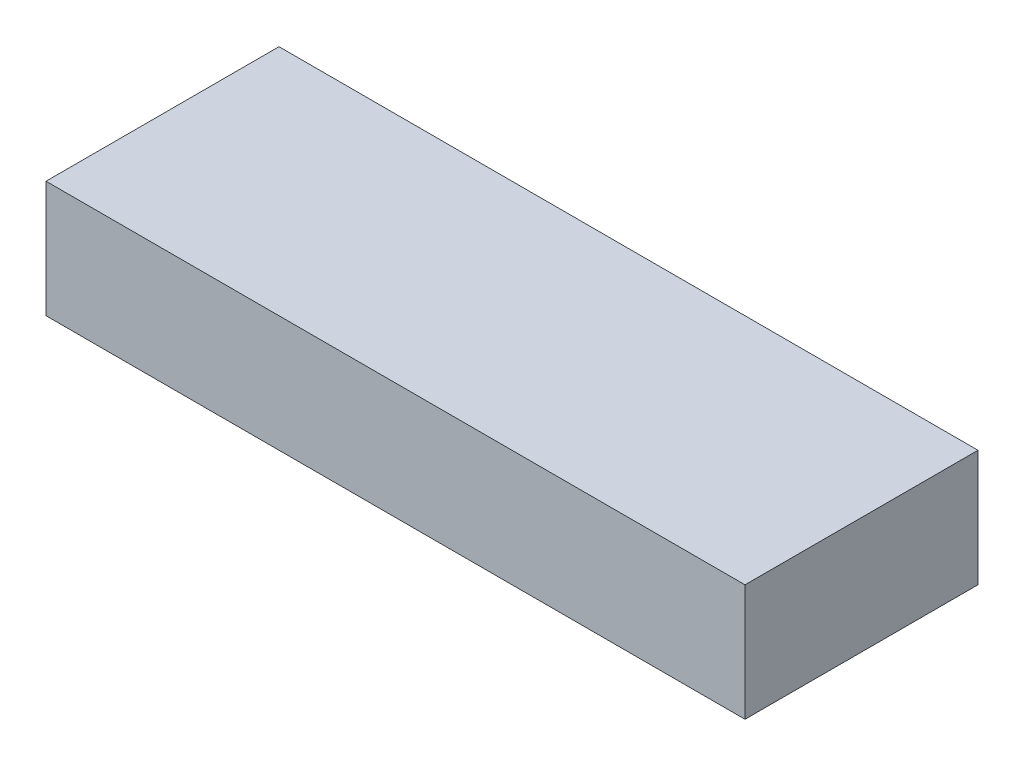
ISO-10303-21;
HEADER;
FILE_DESCRIPTION(('STEP AP214'),'2;1');
FILE_NAME('part.step','',(''),(''),'','','');
FILE_SCHEMA(('AUTOMOTIVE_DESIGN { 1 0 10303 214 1 1 1 1 }'));
ENDSEC;
DATA;
#1=APPLICATION_CONTEXT('core data for automotive mechanical design processes');
#2=APPLICATION_PROTOCOL_DEFINITION('international standard','automotive_design',2000,#1);
#3=PRODUCT_CONTEXT('',#1,'mechanical');
#4=PRODUCT('Part','Part','',(#3));
#5=PRODUCT_RELATED_PRODUCT_CATEGORY('part','',(#4));
#6=PRODUCT_DEFINITION_FORMATION('','',#4);
#7=PRODUCT_DEFINITION_CONTEXT('part definition',#1,'design');
#8=PRODUCT_DEFINITION('design','',#6,#7);
#9=PRODUCT_DEFINITION_SHAPE('','',#8);
#10=(LENGTH_UNIT() NAMED_UNIT(*) SI_UNIT(.MILLI.,.METRE.));
#11=(NAMED_UNIT(*) PLANE_ANGLE_UNIT() SI_UNIT($,.RADIAN.));
#12=(NAMED_UNIT(*) SI_UNIT($,.STERADIAN.) SOLID_ANGLE_UNIT());
#13=UNCERTAINTY_MEASURE_WITH_UNIT(LENGTH_MEASURE(1.E-05),#10,'distance_accuracy_value','');
#14=(GEOMETRIC_REPRESENTATION_CONTEXT(3) GLOBAL_UNCERTAINTY_ASSIGNED_CONTEXT((#13)) GLOBAL_UNIT_ASSIGNED_CONTEXT((#10,
#11,#12)) REPRESENTATION_CONTEXT('',''));
#15=CARTESIAN_POINT('',(0.,0.,0.));
#16=DIRECTION('',(0.,0.,1.));
#17=DIRECTION('',(1.,0.,0.));
#18=AXIS2_PLACEMENT_3D('',#15,#16,#17);
#19=CARTESIAN_POINT('',(38.1,6.35,12.7));
#20=DIRECTION('',(-1.,0.,0.));
#21=DIRECTION('',(0.,0.,1.));
#22=AXIS2_PLACEMENT_3D('',#19,#20,#21);
#23=PLANE('',#22);
#24=DIRECTION('',(0.,0.,-1.));
#25=VECTOR('',#24,1.);
#26=CARTESIAN_POINT('',(38.1,-6.35,12.7));
#27=LINE('',#26,#25);
#28=CARTESIAN_POINT('',(38.1,-6.35,12.7));
#29=VERTEX_POINT('',#28);
#30=CARTESIAN_POINT('',(38.1,-6.35,-12.7));
#31=VERTEX_POINT('',#30);
#32=EDGE_CURVE('E98',#29,#31,#27,.T.);
#33=ORIENTED_EDGE('',*,*,#32,.T.);
#34=DIRECTION('',(0.,-1.,0.));
#35=VECTOR('',#34,1.);
#36=CARTESIAN_POINT('',(38.1,6.35,-12.7));
#37=LINE('',#36,#35);
#38=CARTESIAN_POINT('',(38.1,6.35,-12.7));
#39=VERTEX_POINT('',#38);
#40=EDGE_CURVE('E11',#39,#31,#37,.T.);
#41=ORIENTED_EDGE('',*,*,#40,.F.);
#42=DIRECTION('',(0.,0.,-1.));
#43=VECTOR('',#42,1.);
#44=CARTESIAN_POINT('',(38.1,6.35,12.7));
#45=LINE('',#44,#43);
#46=CARTESIAN_POINT('',(38.1,6.35,12.7));
#47=VERTEX_POINT('',#46);
#48=EDGE_CURVE('E86',#47,#39,#45,.T.);
#49=ORIENTED_EDGE('',*,*,#48,.F.);
#50=DIRECTION('',(0.,-1.,0.));
#51=VECTOR('',#50,1.);
#52=CARTESIAN_POINT('',(38.1,6.35,12.7));
#53=LINE('',#52,#51);
#54=EDGE_CURVE('E94',#47,#29,#53,.T.);
#55=ORIENTED_EDGE('',*,*,#54,.T.);
#56=EDGE_LOOP('',(#33,#41,#49,#55));
#57=FACE_BOUND('',#56,.T.);
#58=ADVANCED_FACE('F35',(#57),#23,.F.);
#59=CARTESIAN_POINT('',(-38.1,6.35,-12.7));
#60=DIRECTION('',(0.,0.,1.));
#61=DIRECTION('',(1.,0.,0.));
#62=AXIS2_PLACEMENT_3D('',#59,#60,#61);
#63=PLANE('',#62);
#64=DIRECTION('',(-1.,0.,0.));
#65=VECTOR('',#64,1.);
#66=CARTESIAN_POINT('',(-38.1,-6.35,-12.7));
#67=LINE('',#66,#65);
#68=CARTESIAN_POINT('',(-38.1,-6.35,-12.7));
#69=VERTEX_POINT('',#68);
#70=EDGE_CURVE('E90',#31,#69,#67,.T.);
#71=ORIENTED_EDGE('',*,*,#70,.T.);
#72=DIRECTION('',(0.,-1.,0.));
#73=VECTOR('',#72,1.);
#74=CARTESIAN_POINT('',(-38.1,6.35,-12.7));
#75=LINE('',#74,#73);
#76=CARTESIAN_POINT('',(-38.1,6.35,-12.7));
#77=VERTEX_POINT('',#76);
#78=EDGE_CURVE('E43',#77,#69,#75,.T.);
#79=ORIENTED_EDGE('',*,*,#78,.F.);
#80=DIRECTION('',(-1.,0.,0.));
#81=VECTOR('',#80,1.);
#82=CARTESIAN_POINT('',(-38.1,6.35,-12.7));
#83=LINE('',#82,#81);
#84=EDGE_CURVE('E81',#39,#77,#83,.T.);
#85=ORIENTED_EDGE('',*,*,#84,.F.);
#86=ORIENTED_EDGE('',*,*,#40,.T.);
#87=EDGE_LOOP('',(#71,#79,#85,#86));
#88=FACE_BOUND('',#87,.T.);
#89=ADVANCED_FACE('F89',(#88),#63,.F.);
#90=CARTESIAN_POINT('',(-38.1,6.35,12.7));
#91=DIRECTION('',(1.,0.,0.));
#92=DIRECTION('',(0.,0.,-1.));
#93=AXIS2_PLACEMENT_3D('',#90,#91,#92);
#94=PLANE('',#93);
#95=DIRECTION('',(0.,0.,1.));
#96=VECTOR('',#95,1.);
#97=CARTESIAN_POINT('',(-38.1,-6.35,12.7));
#98=LINE('',#97,#96);
#99=CARTESIAN_POINT('',(-38.1,-6.35,12.7));
#100=VERTEX_POINT('',#99);
#101=EDGE_CURVE('E68',#69,#100,#98,.T.);
#102=ORIENTED_EDGE('',*,*,#101,.T.);
#103=DIRECTION('',(0.,-1.,0.));
#104=VECTOR('',#103,1.);
#105=CARTESIAN_POINT('',(-38.1,6.35,12.7));
#106=LINE('',#105,#104);
#107=CARTESIAN_POINT('',(-38.1,6.35,12.7));
#108=VERTEX_POINT('',#107);
#109=EDGE_CURVE('E91',#108,#100,#106,.T.);
#110=ORIENTED_EDGE('',*,*,#109,.F.);
#111=DIRECTION('',(0.,0.,1.));
#112=VECTOR('',#111,1.);
#113=CARTESIAN_POINT('',(-38.1,6.35,12.7));
#114=LINE('',#113,#112);
#115=EDGE_CURVE('E84',#77,#108,#114,.T.);
#116=ORIENTED_EDGE('',*,*,#115,.F.);
#117=ORIENTED_EDGE('',*,*,#78,.T.);
#118=EDGE_LOOP('',(#102,#110,#116,#117));
#119=FACE_BOUND('',#118,.T.);
#120=ADVANCED_FACE('F92',(#119),#94,.F.);
#121=CARTESIAN_POINT('',(-38.1,6.35,12.7));
#122=DIRECTION('',(0.,0.,-1.));
#123=DIRECTION('',(-1.,0.,0.));
#124=AXIS2_PLACEMENT_3D('',#121,#122,#123);
#125=PLANE('',#124);
#126=DIRECTION('',(1.,0.,0.));
#127=VECTOR('',#126,1.);
#128=CARTESIAN_POINT('',(-38.1,-6.35,12.7));
#129=LINE('',#128,#127);
#130=EDGE_CURVE('E74',#100,#29,#129,.T.);
#131=ORIENTED_EDGE('',*,*,#130,.T.);
#132=ORIENTED_EDGE('',*,*,#54,.F.);
#133=DIRECTION('',(1.,0.,0.));
#134=VECTOR('',#133,1.);
#135=CARTESIAN_POINT('',(-38.1,6.35,12.7));
#136=LINE('',#135,#134);
#137=EDGE_CURVE('E51',#108,#47,#136,.T.);
#138=ORIENTED_EDGE('',*,*,#137,.F.);
#139=ORIENTED_EDGE('',*,*,#109,.T.);
#140=EDGE_LOOP('',(#131,#132,#138,#139));
#141=FACE_BOUND('',#140,.T.);
#142=ADVANCED_FACE('F105',(#141),#125,.F.);
#143=CARTESIAN_POINT('',(0.,6.35,0.));
#144=DIRECTION('',(0.,-1.,0.));
#145=DIRECTION('',(0.,0.,-1.));
#146=AXIS2_PLACEMENT_3D('',#143,#144,#145);
#147=PLANE('',#146);
#148=ORIENTED_EDGE('',*,*,#48,.T.);
#149=ORIENTED_EDGE('',*,*,#84,.T.);
#150=ORIENTED_EDGE('',*,*,#115,.T.);
#151=ORIENTED_EDGE('',*,*,#137,.T.);
#152=EDGE_LOOP('',(#148,#149,#150,#151));
#153=FACE_BOUND('',#152,.T.);
#154=ADVANCED_FACE('F82',(#153),#147,.F.);
#155=CARTESIAN_POINT('',(0.,-6.35,0.));
#156=DIRECTION('',(0.,-1.,0.));
#157=DIRECTION('',(0.,0.,-1.));
#158=AXIS2_PLACEMENT_3D('',#155,#156,#157);
#159=PLANE('',#158);
#160=ORIENTED_EDGE('',*,*,#32,.F.);
#161=ORIENTED_EDGE('',*,*,#130,.F.);
#162=ORIENTED_EDGE('',*,*,#101,.F.);
#163=ORIENTED_EDGE('',*,*,#70,.F.);
#164=EDGE_LOOP('',(#160,#161,#162,#163));
#165=FACE_BOUND('',#164,.T.);
#166=ADVANCED_FACE('F108',(#165),#159,.T.);
#167=CLOSED_SHELL('',(#58,#89,#120,#142,#154,#166));
#168=MANIFOLD_SOLID_BREP('B2',#167);
#169=ADVANCED_BREP_SHAPE_REPRESENTATION('',(#18,#168),#14);
#170=SHAPE_DEFINITION_REPRESENTATION(#9,#169);
ENDSEC;
END-ISO-10303-21;
